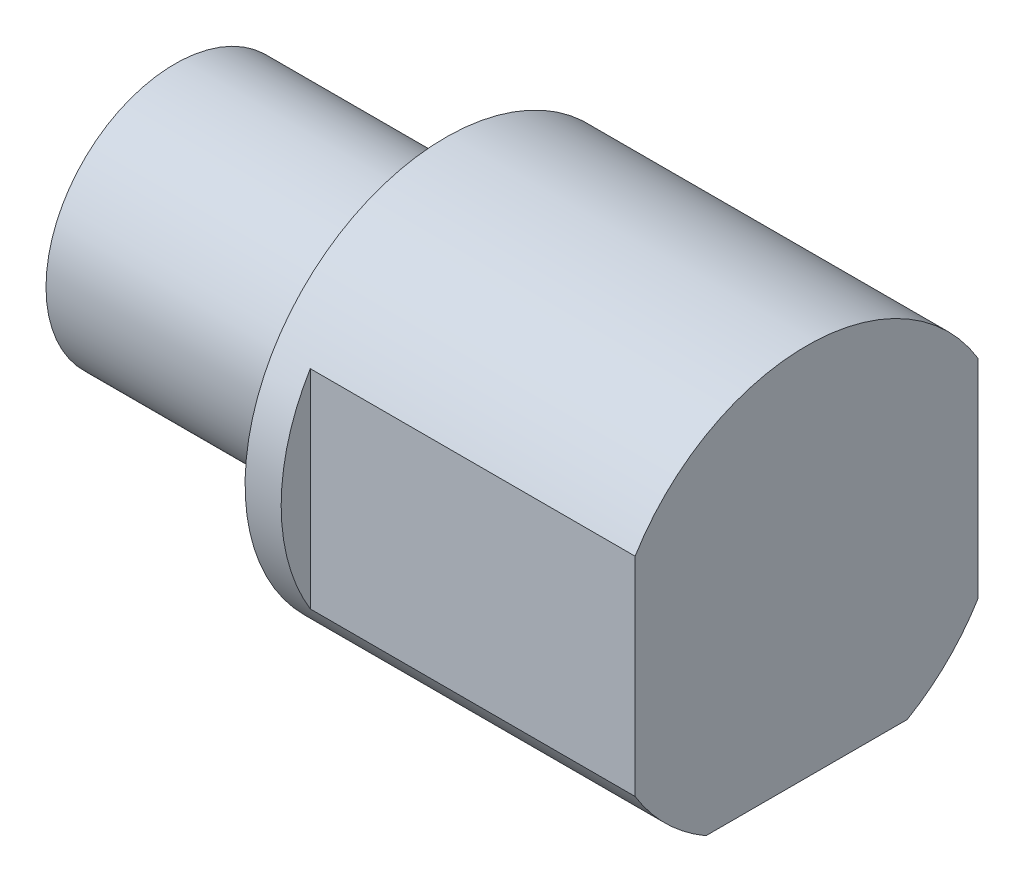
ISO-10303-21;
HEADER;
FILE_DESCRIPTION(('STEP AP214'),'2;1');
FILE_NAME('part.step','',(''),(''),'','','');
FILE_SCHEMA(('AUTOMOTIVE_DESIGN { 1 0 10303 214 1 1 1 1 }'));
ENDSEC;
DATA;
#1=APPLICATION_CONTEXT('core data for automotive mechanical design processes');
#2=APPLICATION_PROTOCOL_DEFINITION('international standard','automotive_design',2000,#1);
#3=PRODUCT_CONTEXT('',#1,'mechanical');
#4=PRODUCT('Part','Part','',(#3));
#5=PRODUCT_RELATED_PRODUCT_CATEGORY('part','',(#4));
#6=PRODUCT_DEFINITION_FORMATION('','',#4);
#7=PRODUCT_DEFINITION_CONTEXT('part definition',#1,'design');
#8=PRODUCT_DEFINITION('design','',#6,#7);
#9=PRODUCT_DEFINITION_SHAPE('','',#8);
#10=(LENGTH_UNIT() NAMED_UNIT(*) SI_UNIT(.MILLI.,.METRE.));
#11=(NAMED_UNIT(*) PLANE_ANGLE_UNIT() SI_UNIT($,.RADIAN.));
#12=(NAMED_UNIT(*) SI_UNIT($,.STERADIAN.) SOLID_ANGLE_UNIT());
#13=UNCERTAINTY_MEASURE_WITH_UNIT(LENGTH_MEASURE(1.E-05),#10,'distance_accuracy_value','');
#14=(GEOMETRIC_REPRESENTATION_CONTEXT(3) GLOBAL_UNCERTAINTY_ASSIGNED_CONTEXT((#13)) GLOBAL_UNIT_ASSIGNED_CONTEXT((#10,
#11,#12)) REPRESENTATION_CONTEXT('',''));
#15=CARTESIAN_POINT('',(0.,0.,0.));
#16=DIRECTION('',(0.,0.,1.));
#17=DIRECTION('',(1.,0.,0.));
#18=AXIS2_PLACEMENT_3D('',#15,#16,#17);
#19=CARTESIAN_POINT('',(15.,0.,0.));
#20=DIRECTION('',(-1.,0.,0.));
#21=DIRECTION('',(0.,0.,1.));
#22=AXIS2_PLACEMENT_3D('',#19,#20,#21);
#23=CYLINDRICAL_SURFACE('',#22,7.14375);
#24=CARTESIAN_POINT('',(15.,0.,0.));
#25=DIRECTION('',(1.,0.,0.));
#26=DIRECTION('',(0.,0.,-1.));
#27=AXIS2_PLACEMENT_3D('',#24,#25,#26);
#28=CIRCLE('',#27,7.14375);
#29=CARTESIAN_POINT('',(15.,0.,-7.14375));
#30=VERTEX_POINT('',#29);
#31=EDGE_CURVE('E199',#30,#30,#28,.T.);
#32=ORIENTED_EDGE('',*,*,#31,.F.);
#33=EDGE_LOOP('',(#32));
#34=FACE_BOUND('',#33,.T.);
#35=CARTESIAN_POINT('',(0.,0.,0.));
#36=DIRECTION('',(1.,0.,0.));
#37=DIRECTION('',(0.,0.,-1.));
#38=AXIS2_PLACEMENT_3D('',#35,#36,#37);
#39=CIRCLE('',#38,7.14375);
#40=CARTESIAN_POINT('',(0.,0.,-7.14375));
#41=VERTEX_POINT('',#40);
#42=EDGE_CURVE('E202',#41,#41,#39,.T.);
#43=ORIENTED_EDGE('',*,*,#42,.T.);
#44=EDGE_LOOP('',(#43));
#45=FACE_BOUND('',#44,.T.);
#46=ADVANCED_FACE('F32',(#34,#45),#23,.T.);
#47=CARTESIAN_POINT('',(0.,0.,0.));
#48=DIRECTION('',(1.,0.,0.));
#49=DIRECTION('',(0.,0.,-1.));
#50=AXIS2_PLACEMENT_3D('',#47,#48,#49);
#51=PLANE('',#50);
#52=CARTESIAN_POINT('',(0.,0.,0.));
#53=DIRECTION('',(-1.,0.,0.));
#54=DIRECTION('',(0.,0.,1.));
#55=AXIS2_PLACEMENT_3D('',#52,#53,#54);
#56=CIRCLE('',#55,5.15874);
#57=CARTESIAN_POINT('',(0.,0.,5.15874));
#58=VERTEX_POINT('',#57);
#59=EDGE_CURVE('E240',#58,#58,#56,.T.);
#60=ORIENTED_EDGE('',*,*,#59,.F.);
#61=EDGE_LOOP('',(#60));
#62=FACE_BOUND('',#61,.T.);
#63=ORIENTED_EDGE('',*,*,#42,.F.);
#64=EDGE_LOOP('',(#63));
#65=FACE_BOUND('',#64,.T.);
#66=ADVANCED_FACE('F190',(#62,#65),#51,.F.);
#67=CARTESIAN_POINT('',(35.,0.,0.));
#68=DIRECTION('',(-1.,0.,0.));
#69=DIRECTION('',(0.,0.,1.));
#70=AXIS2_PLACEMENT_3D('',#67,#68,#69);
#71=CYLINDRICAL_SURFACE('',#70,11.1125);
#72=CARTESIAN_POINT('',(35.,0.,0.));
#73=DIRECTION('',(1.,0.,0.));
#74=DIRECTION('',(0.,0.,-1.));
#75=AXIS2_PLACEMENT_3D('',#72,#73,#74);
#76=CIRCLE('',#75,11.1125);
#77=CARTESIAN_POINT('',(35.,-9.6125,-5.57561655783466));
#78=VERTEX_POINT('',#77);
#79=CARTESIAN_POINT('',(35.,-5.76521085911001,-9.5));
#80=VERTEX_POINT('',#79);
#81=EDGE_CURVE('E116',#78,#80,#76,.T.);
#82=ORIENTED_EDGE('',*,*,#81,.F.);
#83=DIRECTION('',(-1.,0.,0.));
#84=VECTOR('',#83,1.);
#85=CARTESIAN_POINT('',(35.,-9.6125,-5.57561655783466));
#86=LINE('',#85,#84);
#87=CARTESIAN_POINT('',(17.,-9.6125,-5.57561655783466));
#88=VERTEX_POINT('',#87);
#89=EDGE_CURVE('E46',#78,#88,#86,.T.);
#90=ORIENTED_EDGE('',*,*,#89,.T.);
#91=CARTESIAN_POINT('',(17.,0.,0.));
#92=DIRECTION('',(-1.,0.,0.));
#93=DIRECTION('',(0.,0.,1.));
#94=AXIS2_PLACEMENT_3D('',#91,#92,#93);
#95=CIRCLE('',#94,11.1125);
#96=CARTESIAN_POINT('',(17.,-9.6125,5.57561655783466));
#97=VERTEX_POINT('',#96);
#98=EDGE_CURVE('E11',#88,#97,#95,.T.);
#99=ORIENTED_EDGE('',*,*,#98,.T.);
#100=DIRECTION('',(-1.,0.,0.));
#101=VECTOR('',#100,1.);
#102=CARTESIAN_POINT('',(35.,-9.6125,5.57561655783466));
#103=LINE('',#102,#101);
#104=CARTESIAN_POINT('',(35.,-9.6125,5.57561655783466));
#105=VERTEX_POINT('',#104);
#106=EDGE_CURVE('E99',#97,#105,#103,.F.);
#107=ORIENTED_EDGE('',*,*,#106,.T.);
#108=CARTESIAN_POINT('',(35.,-5.76521085911001,9.5));
#109=VERTEX_POINT('',#108);
#110=EDGE_CURVE('E209',#109,#105,#76,.T.);
#111=ORIENTED_EDGE('',*,*,#110,.F.);
#112=DIRECTION('',(-1.,0.,0.));
#113=VECTOR('',#112,1.);
#114=CARTESIAN_POINT('',(35.,-5.76521085911001,9.5));
#115=LINE('',#114,#113);
#116=CARTESIAN_POINT('',(17.,-5.76521085911001,9.5));
#117=VERTEX_POINT('',#116);
#118=EDGE_CURVE('E224',#109,#117,#115,.T.);
#119=ORIENTED_EDGE('',*,*,#118,.T.);
#120=CARTESIAN_POINT('',(17.,0.,0.));
#121=DIRECTION('',(-1.,0.,0.));
#122=DIRECTION('',(0.,0.,1.));
#123=AXIS2_PLACEMENT_3D('',#120,#121,#122);
#124=CIRCLE('',#123,11.1125);
#125=CARTESIAN_POINT('',(17.,5.76521085911001,9.5));
#126=VERTEX_POINT('',#125);
#127=EDGE_CURVE('E160',#117,#126,#124,.T.);
#128=ORIENTED_EDGE('',*,*,#127,.T.);
#129=DIRECTION('',(-1.,0.,0.));
#130=VECTOR('',#129,1.);
#131=CARTESIAN_POINT('',(35.,5.76521085911001,9.5));
#132=LINE('',#131,#130);
#133=CARTESIAN_POINT('',(35.,5.76521085911001,9.5));
#134=VERTEX_POINT('',#133);
#135=EDGE_CURVE('E223',#126,#134,#132,.F.);
#136=ORIENTED_EDGE('',*,*,#135,.T.);
#137=CARTESIAN_POINT('',(35.,5.76521085911001,-9.5));
#138=VERTEX_POINT('',#137);
#139=EDGE_CURVE('E204',#138,#134,#76,.T.);
#140=ORIENTED_EDGE('',*,*,#139,.F.);
#141=DIRECTION('',(-1.,0.,0.));
#142=VECTOR('',#141,1.);
#143=CARTESIAN_POINT('',(35.,5.76521085911001,-9.5));
#144=LINE('',#143,#142);
#145=CARTESIAN_POINT('',(17.,5.76521085911001,-9.5));
#146=VERTEX_POINT('',#145);
#147=EDGE_CURVE('E237',#138,#146,#144,.T.);
#148=ORIENTED_EDGE('',*,*,#147,.T.);
#149=CARTESIAN_POINT('',(17.,0.,0.));
#150=DIRECTION('',(-1.,0.,0.));
#151=DIRECTION('',(0.,0.,1.));
#152=AXIS2_PLACEMENT_3D('',#149,#150,#151);
#153=CIRCLE('',#152,11.1125);
#154=CARTESIAN_POINT('',(17.,-5.76521085911001,-9.5));
#155=VERTEX_POINT('',#154);
#156=EDGE_CURVE('E215',#146,#155,#153,.T.);
#157=ORIENTED_EDGE('',*,*,#156,.T.);
#158=DIRECTION('',(-1.,0.,0.));
#159=VECTOR('',#158,1.);
#160=CARTESIAN_POINT('',(35.,-5.76521085911001,-9.5));
#161=LINE('',#160,#159);
#162=EDGE_CURVE('E235',#155,#80,#161,.F.);
#163=ORIENTED_EDGE('',*,*,#162,.T.);
#164=EDGE_LOOP('',(#82,#90,#99,#107,#111,#119,#128,#136,#140,#148,#157,#163));
#165=FACE_BOUND('',#164,.T.);
#166=CARTESIAN_POINT('',(15.,0.,0.));
#167=DIRECTION('',(1.,0.,0.));
#168=DIRECTION('',(0.,0.,-1.));
#169=AXIS2_PLACEMENT_3D('',#166,#167,#168);
#170=CIRCLE('',#169,11.1125);
#171=CARTESIAN_POINT('',(15.,0.,-11.1125));
#172=VERTEX_POINT('',#171);
#173=EDGE_CURVE('E245',#172,#172,#170,.T.);
#174=ORIENTED_EDGE('',*,*,#173,.T.);
#175=EDGE_LOOP('',(#174));
#176=FACE_BOUND('',#175,.T.);
#177=ADVANCED_FACE('F113',(#165,#176),#71,.T.);
#178=CARTESIAN_POINT('',(35.,0.,0.));
#179=DIRECTION('',(1.,0.,0.));
#180=DIRECTION('',(0.,0.,-1.));
#181=AXIS2_PLACEMENT_3D('',#178,#179,#180);
#182=PLANE('',#181);
#183=DIRECTION('',(0.,0.,-1.));
#184=VECTOR('',#183,1.);
#185=CARTESIAN_POINT('',(35.,-9.6125,11.1125));
#186=LINE('',#185,#184);
#187=EDGE_CURVE('E103',#105,#78,#186,.T.);
#188=ORIENTED_EDGE('',*,*,#187,.T.);
#189=ORIENTED_EDGE('',*,*,#81,.T.);
#190=DIRECTION('',(0.,-1.,0.));
#191=VECTOR('',#190,1.);
#192=CARTESIAN_POINT('',(35.,0.,-9.5));
#193=LINE('',#192,#191);
#194=EDGE_CURVE('E206',#138,#80,#193,.T.);
#195=ORIENTED_EDGE('',*,*,#194,.F.);
#196=ORIENTED_EDGE('',*,*,#139,.T.);
#197=DIRECTION('',(0.,1.,0.));
#198=VECTOR('',#197,1.);
#199=CARTESIAN_POINT('',(35.,0.,9.5));
#200=LINE('',#199,#198);
#201=EDGE_CURVE('E217',#109,#134,#200,.T.);
#202=ORIENTED_EDGE('',*,*,#201,.F.);
#203=ORIENTED_EDGE('',*,*,#110,.T.);
#204=EDGE_LOOP('',(#188,#189,#195,#196,#202,#203));
#205=FACE_BOUND('',#204,.T.);
#206=ADVANCED_FACE('F250',(#205),#182,.T.);
#207=CARTESIAN_POINT('',(15.,0.,0.));
#208=DIRECTION('',(1.,0.,0.));
#209=DIRECTION('',(0.,0.,-1.));
#210=AXIS2_PLACEMENT_3D('',#207,#208,#209);
#211=PLANE('',#210);
#212=ORIENTED_EDGE('',*,*,#31,.T.);
#213=EDGE_LOOP('',(#212));
#214=FACE_BOUND('',#213,.T.);
#215=ORIENTED_EDGE('',*,*,#173,.F.);
#216=EDGE_LOOP('',(#215));
#217=FACE_BOUND('',#216,.T.);
#218=ADVANCED_FACE('F333',(#214,#217),#211,.F.);
#219=CARTESIAN_POINT('',(26.6628162901977,0.,0.));
#220=DIRECTION('',(-1.,0.,0.));
#221=DIRECTION('',(0.,0.,1.));
#222=AXIS2_PLACEMENT_3D('',#219,#220,#221);
#223=CONICAL_SURFACE('',#222,5.15874,1.02974425867665);
#224=CARTESIAN_POINT('',(29.7625,0.,0.));
#225=CARTESIAN_POINT('',(29.7624930028615,4.20430499467001E-06,1.08597593433312E-05));
#226=CARTESIAN_POINT('',(29.7624860057229,8.4085876942521E-06,2.17195272931255E-05));
#227=CARTESIAN_POINT('',(29.762444672713,3.32437019313987E-05,8.5869643104111E-05));
#228=CARTESIAN_POINT('',(29.7624103368409,5.38740187837906E-05,0.000139160189751005));
#229=CARTESIAN_POINT('',(29.7622386574811,0.000157022915305526,0.000405613963916012));
#230=CARTESIAN_POINT('',(29.762101313995,0.000239533431615619,0.000618780313867793));
#231=CARTESIAN_POINT('',(29.7614145965602,0.000652043000831133,0.00168462872218226));
#232=CARTESIAN_POINT('',(29.7608652226125,0.000981913007836379,0.0025373607332351));
#233=CARTESIAN_POINT('',(29.7581183525929,0.0026305740280279,0.00680128774402228));
#234=CARTESIAN_POINT('',(29.7559208566313,0.00394729742416479,0.0102132821314489));
#235=CARTESIAN_POINT('',(29.7449333563568,0.0105198361626609,0.0272775638157698));
#236=CARTESIAN_POINT('',(29.7361433529909,0.0157423793156134,0.0409426835898945));
#237=CARTESIAN_POINT('',(29.6921920071205,0.0416744526543953,0.109339486849523));
#238=CARTESIAN_POINT('',(29.6570310334146,0.061839437540482,0.164278023117815));
#239=CARTESIAN_POINT('',(29.5514465610366,0.120488892831472,0.329945025095136));
#240=CARTESIAN_POINT('',(29.481025805915,0.157062403850388,0.441363979368093));
#241=CARTESIAN_POINT('',(29.3402893635549,0.224155777483775,0.665981503868459));
#242=CARTESIAN_POINT('',(29.2699736388907,0.254679185175096,0.779178989738839));
#243=CARTESIAN_POINT('',(29.1017829483487,0.319380048804845,1.05228380627182));
#244=CARTESIAN_POINT('',(29.0039602925985,0.350262443525442,1.21302993706946));
#245=CARTESIAN_POINT('',(28.8087958409162,0.396210816178389,1.53711480573167));
#246=CARTESIAN_POINT('',(28.711454088001,0.411275403812248,1.70045377021148));
#247=CARTESIAN_POINT('',(28.5167793848732,0.424598257690499,2.0294961429927));
#248=CARTESIAN_POINT('',(28.4194520326518,0.42272897569222,2.1952080932801));
#249=CARTESIAN_POINT('',(28.2257081522414,0.402490217050304,2.52607394990571));
#250=CARTESIAN_POINT('',(28.129291475528,0.384123479673208,2.69122794431843));
#251=CARTESIAN_POINT('',(27.9395179409233,0.333439263840167,3.0159062317535));
#252=CARTESIAN_POINT('',(27.8461417839411,0.30145314363354,3.17547253791926));
#253=CARTESIAN_POINT('',(27.6599807528108,0.225923382627303,3.49223910255772));
#254=CARTESIAN_POINT('',(27.5671961535237,0.182374720638695,3.64943830166654));
#255=CARTESIAN_POINT('',(27.3817153817414,0.0858297352478213,3.96172777747655));
#256=CARTESIAN_POINT('',(27.2890206931297,0.032800413516446,4.11680858359344));
#257=CARTESIAN_POINT('',(27.1038645806189,-0.0806339358714834,4.42433071549515));
#258=CARTESIAN_POINT('',(27.011403127568,-0.141037989858388,4.57677238669122));
#259=CARTESIAN_POINT('',(26.8280694002558,-0.266622200390302,4.87674877485534));
#260=CARTESIAN_POINT('',(26.737196043658,-0.331707261621015,5.02432295708092));
#261=CARTESIAN_POINT('',(26.5554018045496,-0.466362492464465,5.31738826333468));
#262=CARTESIAN_POINT('',(26.4644809189344,-0.535933004897966,5.4628792271025));
#263=CARTESIAN_POINT('',(26.2833352098978,-0.678026635160563,5.75073001163144));
#264=CARTESIAN_POINT('',(26.1931113648143,-0.750518094188772,5.89310615827454));
#265=CARTESIAN_POINT('',(26.0125435429469,-0.898368455418109,6.17621663874536));
#266=CARTESIAN_POINT('',(25.9221996095388,-0.973726503984765,6.31695144528307));
#267=CARTESIAN_POINT('',(25.8317633451439,-1.05021216751675,6.45699481970518));
#268=B_SPLINE_CURVE_WITH_KNOTS('',3,(#224,#225,#226,#227,#228,#229,#230,#231,#232,#233,#234,
#235,#236,#237,#238,#239,#240,#241,#242,#243,#244,#245,#246,#247,#248,#249,#250,#251,#252,#253,
#254,#255,#256,#257,#258,#259,#260,#261,#262,#263,#264,#265,#266,#267),.UNSPECIFIED.,.F.,.F.,(4,
2,2,2,2,2,2,2,2,2,2,2,2,2,2,2,2,2,2,2,2,4),(0.,4.07570179373821E-05,0.000240757017945375,
0.00104075701842514,0.00424075704908811,0.0170407590218322,0.068240887966296,0.273049861180939,
0.683275266655643,1.0932595840344,1.66470584038183,2.23620231951776,2.81200694714631,
3.38771598483056,3.95015355294188,4.51283576774208,5.07751599410287,5.64212174743628,
6.19742446811935,6.75276968073586,7.30318956511519,7.8534468051391),.UNSPECIFIED.);
#269=CARTESIAN_POINT('',(29.7625,0.,0.));
#270=VERTEX_POINT('',#269);
#271=CARTESIAN_POINT('',(27.2358583177678,0.,4.20503791099066));
#272=VERTEX_POINT('',#271);
#273=EDGE_CURVE('E39',#270,#272,#268,.T.);
#274=ORIENTED_EDGE('',*,*,#273,.T.);
#275=CARTESIAN_POINT('',(27.2081996871113,0.516074000000099,4.21962799211513));
#276=CARTESIAN_POINT('',(27.2147462195101,0.45438715155513,4.21620059050692));
#277=CARTESIAN_POINT('',(27.2201736852466,0.39255271257799,4.21334266670164));
#278=CARTESIAN_POINT('',(27.2286948483538,0.268676666289225,4.20884195519441));
#279=CARTESIAN_POINT('',(27.2317884226392,0.206635048224627,4.20719923158005));
#280=CARTESIAN_POINT('',(27.2374150191848,0.0206372787228872,4.20421335427265));
#281=CARTESIAN_POINT('',(27.2363260121284,-0.103486745582434,4.20479544113461));
#282=CARTESIAN_POINT('',(27.224650729984,-0.349317759308329,4.21098210998094));
#283=CARTESIAN_POINT('',(27.2142025790625,-0.471033675675645,4.21651364566125));
#284=CARTESIAN_POINT('',(27.1849401273388,-0.713191362492389,4.2317505812388));
#285=CARTESIAN_POINT('',(27.1661233989748,-0.833632752840136,4.24145719221744));
#286=CARTESIAN_POINT('',(27.1053451627183,-1.15947442502139,4.27208970915762));
#287=CARTESIAN_POINT('',(27.0564890127045,-1.36327644577151,4.29605117232379));
#288=CARTESIAN_POINT('',(26.94475966781,-1.76671218809316,4.34776939236104));
#289=CARTESIAN_POINT('',(26.8818589438489,-1.9663368693707,4.37553356110583));
#290=CARTESIAN_POINT('',(26.7796110372663,-2.26632748747554,4.41767231698734));
#291=CARTESIAN_POINT('',(26.7436381268347,-2.36787237004317,4.43200933163143));
#292=CARTESIAN_POINT('',(26.6696863834803,-2.57027568927651,4.46039421271488));
#293=CARTESIAN_POINT('',(26.631707463181,-2.67113409582478,4.47444206652208));
#294=CARTESIAN_POINT('',(26.5543019865565,-2.87182600165777,4.50191403303865));
#295=CARTESIAN_POINT('',(26.5148830309958,-2.971662088197,4.51534075553594));
#296=CARTESIAN_POINT('',(26.4347048226713,-3.17087592564999,4.541455393787));
#297=CARTESIAN_POINT('',(26.3939457555845,-3.27025373790172,4.55414341122149));
#298=CARTESIAN_POINT('',(26.3526479192175,-3.36946167222788,4.56637162927379));
#299=B_SPLINE_CURVE_WITH_KNOTS('',3,(#275,#276,#277,#278,#279,#280,#281,#282,#283,#284,#285,
#286,#287,#288,#289,#290,#291,#292,#293,#294,#295,#296,#297,#298),.UNSPECIFIED.,.F.,.F.,(4,2,2,
2,2,2,2,2,2,2,2,4),(0.,0.186362455724692,0.372734739191113,0.744590841585828,1.11104781819082,
1.47761116625322,2.1094680311672,2.74257445823186,3.06859187304861,3.39462350004633,
3.71913038428323,4.04359249491526),.UNSPECIFIED.);
#300=CARTESIAN_POINT('',(26.6628162901977,-2.58769205133589,4.46278480716391));
#301=VERTEX_POINT('',#300);
#302=EDGE_CURVE('E130',#272,#301,#299,.T.);
#303=ORIENTED_EDGE('',*,*,#302,.T.);
#304=CARTESIAN_POINT('',(26.6628162901977,0.,0.));
#305=DIRECTION('',(-1.,0.,0.));
#306=DIRECTION('',(0.,0.,1.));
#307=AXIS2_PLACEMENT_3D('',#304,#305,#306);
#308=CIRCLE('',#307,5.15874);
#309=CARTESIAN_POINT('',(26.6628162901977,-2.58769205133589,-4.46278480716391));
#310=VERTEX_POINT('',#309);
#311=EDGE_CURVE('E243',#301,#310,#308,.T.);
#312=ORIENTED_EDGE('',*,*,#311,.T.);
#313=CARTESIAN_POINT('',(26.3526479192175,-3.36946167222788,-4.56637162927379));
#314=CARTESIAN_POINT('',(26.4023722860239,-3.24998032314956,-4.55165409186257));
#315=CARTESIAN_POINT('',(26.451331670443,-3.13025787701526,-4.53625639074325));
#316=CARTESIAN_POINT('',(26.5472338034232,-2.89010006866323,-4.50444214874784));
#317=CARTESIAN_POINT('',(26.5941759238378,-2.76966449748221,-4.48802529435704));
#318=CARTESIAN_POINT('',(26.686100686563,-2.52640119936928,-4.45431281506316));
#319=CARTESIAN_POINT('',(26.7310512080497,-2.40356244730855,-4.43700872711982));
#320=CARTESIAN_POINT('',(26.8176061620485,-2.15673531847772,-4.40225910852575));
#321=CARTESIAN_POINT('',(26.8592108905239,-2.03274704447694,-4.38481359053629));
#322=CARTESIAN_POINT('',(26.9364228912336,-1.78857973114709,-4.35124916527072));
#323=CARTESIAN_POINT('',(26.9722093911762,-1.66846135350444,-4.33510535614245));
#324=CARTESIAN_POINT('',(27.0386784275021,-1.42659297490015,-4.30424669844029));
#325=CARTESIAN_POINT('',(27.0693600911291,-1.30484269877531,-4.28953209439129));
#326=CARTESIAN_POINT('',(27.1240595106145,-1.06022159110557,-4.2627107135526));
#327=CARTESIAN_POINT('',(27.1481115527733,-0.937360053687519,-4.2505905945888));
#328=CARTESIAN_POINT('',(27.1882049950025,-0.690056495352691,-4.23009238616384));
#329=CARTESIAN_POINT('',(27.2042517909812,-0.565615597171812,-4.22171177650273));
#330=CARTESIAN_POINT('',(27.22282959255,-0.361660769216671,-4.21194705238387));
#331=CARTESIAN_POINT('',(27.2281612749298,-0.282465649756153,-4.20912316957932));
#332=CARTESIAN_POINT('',(27.2349060657098,-0.12379915171103,-4.20554586213731));
#333=CARTESIAN_POINT('',(27.2363163990966,-0.0443276173166541,-4.2047939037379));
#334=CARTESIAN_POINT('',(27.2351343173261,0.115507066387072,-4.20542331002818));
#335=CARTESIAN_POINT('',(27.2324947322838,0.195869733931046,-4.206829814636));
#336=CARTESIAN_POINT('',(27.223269281537,0.356268606312871,-4.2117087799542));
#337=CARTESIAN_POINT('',(27.216685284554,0.436304947685788,-4.21518026234637));
#338=CARTESIAN_POINT('',(27.2081996871113,0.516074000000018,-4.21962799211521));
#339=B_SPLINE_CURVE_WITH_KNOTS('',3,(#313,#314,#315,#316,#317,#318,#319,#320,#321,#322,#323,
#324,#325,#326,#327,#328,#329,#330,#331,#332,#333,#334,#335,#336,#337,#338),.UNSPECIFIED.,.F.,
.F.,(4,2,2,2,2,2,2,2,2,2,2,2,4),(0.,0.390753311147557,0.781627428331179,1.17742393069547,
1.57318538295965,1.95220960196476,2.33129855499674,2.70838853587239,3.08522399596442,
3.32338682940146,3.56171816021815,3.80284651078445,4.04386071359388),.UNSPECIFIED.);
#340=CARTESIAN_POINT('',(27.2358583177678,0.,-4.20503791099066));
#341=VERTEX_POINT('',#340);
#342=EDGE_CURVE('E54',#310,#341,#339,.T.);
#343=ORIENTED_EDGE('',*,*,#342,.T.);
#344=CARTESIAN_POINT('',(29.7625,0.,0.));
#345=CARTESIAN_POINT('',(29.7624930028615,4.20430499467001E-06,-1.08597593433312E-05));
#346=CARTESIAN_POINT('',(29.7624860057229,8.4085876942521E-06,-2.17195272931255E-05));
#347=CARTESIAN_POINT('',(29.762444672713,3.32437019313987E-05,-8.5869643104111E-05));
#348=CARTESIAN_POINT('',(29.7624103368409,5.38740187837906E-05,-0.000139160189751005));
#349=CARTESIAN_POINT('',(29.7622386574811,0.000157022915305526,-0.000405613963916012));
#350=CARTESIAN_POINT('',(29.762101313995,0.000239533431615619,-0.000618780313867793));
#351=CARTESIAN_POINT('',(29.7614145965602,0.000652043000831133,-0.00168462872218226));
#352=CARTESIAN_POINT('',(29.7608652226125,0.000981913007836379,-0.0025373607332351));
#353=CARTESIAN_POINT('',(29.7581183525929,0.0026305740280279,-0.00680128774402228));
#354=CARTESIAN_POINT('',(29.7559208566313,0.00394729742416479,-0.0102132821314489));
#355=CARTESIAN_POINT('',(29.7449333563568,0.0105198361626609,-0.0272775638157698));
#356=CARTESIAN_POINT('',(29.7361433529909,0.0157423793156134,-0.0409426835898945));
#357=CARTESIAN_POINT('',(29.6921920071205,0.0416744526543953,-0.109339486849523));
#358=CARTESIAN_POINT('',(29.6570310334146,0.061839437540482,-0.164278023117815));
#359=CARTESIAN_POINT('',(29.5514465610366,0.120488892831472,-0.329945025095136));
#360=CARTESIAN_POINT('',(29.481025805915,0.157062403850388,-0.441363979368093));
#361=CARTESIAN_POINT('',(29.3402893635549,0.224155777483775,-0.665981503868459));
#362=CARTESIAN_POINT('',(29.2699736388907,0.254679185175096,-0.779178989738839));
#363=CARTESIAN_POINT('',(29.1017829483487,0.319380048804845,-1.05228380627182));
#364=CARTESIAN_POINT('',(29.0039602925985,0.350262443525442,-1.21302993706946));
#365=CARTESIAN_POINT('',(28.8087958409162,0.396210816178389,-1.53711480573167));
#366=CARTESIAN_POINT('',(28.711454088001,0.411275403812248,-1.70045377021148));
#367=CARTESIAN_POINT('',(28.5167793848732,0.424598257690499,-2.0294961429927));
#368=CARTESIAN_POINT('',(28.4194520326518,0.42272897569222,-2.1952080932801));
#369=CARTESIAN_POINT('',(28.2257081522414,0.402490217050304,-2.52607394990571));
#370=CARTESIAN_POINT('',(28.129291475528,0.384123479673208,-2.69122794431843));
#371=CARTESIAN_POINT('',(27.9395179409233,0.333439263840167,-3.0159062317535));
#372=CARTESIAN_POINT('',(27.8461417839411,0.30145314363354,-3.17547253791926));
#373=CARTESIAN_POINT('',(27.6599807528108,0.225923382627303,-3.49223910255772));
#374=CARTESIAN_POINT('',(27.5671961535237,0.182374720638695,-3.64943830166654));
#375=CARTESIAN_POINT('',(27.3817153817414,0.0858297352478213,-3.96172777747655));
#376=CARTESIAN_POINT('',(27.2890206931297,0.032800413516446,-4.11680858359344));
#377=CARTESIAN_POINT('',(27.1038645806189,-0.0806339358714834,-4.42433071549515));
#378=CARTESIAN_POINT('',(27.011403127568,-0.141037989858388,-4.57677238669122));
#379=CARTESIAN_POINT('',(26.8280694002558,-0.266622200390302,-4.87674877485534));
#380=CARTESIAN_POINT('',(26.737196043658,-0.331707261621015,-5.02432295708092));
#381=CARTESIAN_POINT('',(26.5554018045496,-0.466362492464465,-5.31738826333468));
#382=CARTESIAN_POINT('',(26.4644809189344,-0.535933004897966,-5.4628792271025));
#383=CARTESIAN_POINT('',(26.2833352098978,-0.678026635160563,-5.75073001163144));
#384=CARTESIAN_POINT('',(26.1931113648143,-0.750518094188772,-5.89310615827454));
#385=CARTESIAN_POINT('',(26.0125435429469,-0.898368455418109,-6.17621663874536));
#386=CARTESIAN_POINT('',(25.9221996095388,-0.973726503984765,-6.31695144528307));
#387=CARTESIAN_POINT('',(25.8317633451439,-1.05021216751675,-6.45699481970518));
#388=B_SPLINE_CURVE_WITH_KNOTS('',3,(#344,#345,#346,#347,#348,#349,#350,#351,#352,#353,#354,
#355,#356,#357,#358,#359,#360,#361,#362,#363,#364,#365,#366,#367,#368,#369,#370,#371,#372,#373,
#374,#375,#376,#377,#378,#379,#380,#381,#382,#383,#384,#385,#386,#387),.UNSPECIFIED.,.F.,.F.,(4,
2,2,2,2,2,2,2,2,2,2,2,2,2,2,2,2,2,2,2,2,4),(0.,4.07570179373821E-05,0.000240757017945375,
0.00104075701842514,0.00424075704908811,0.0170407590218322,0.068240887966296,0.273049861180939,
0.683275266655643,1.0932595840344,1.66470584038183,2.23620231951776,2.81200694714631,
3.38771598483056,3.95015355294188,4.51283576774208,5.07751599410287,5.64212174743628,
6.19742446811935,6.75276968073586,7.30318956511519,7.8534468051391),.UNSPECIFIED.);
#389=EDGE_CURVE('E159',#341,#270,#388,.F.);
#390=ORIENTED_EDGE('',*,*,#389,.T.);
#391=EDGE_LOOP('',(#274,#303,#312,#343,#390));
#392=FACE_BOUND('',#391,.T.);
#393=ADVANCED_FACE('F135',(#392),#223,.F.);
#394=CARTESIAN_POINT('',(0.,0.,0.));
#395=DIRECTION('',(-1.,0.,0.));
#396=DIRECTION('',(0.,0.,1.));
#397=AXIS2_PLACEMENT_3D('',#394,#395,#396);
#398=CYLINDRICAL_SURFACE('',#397,5.15874);
#399=ORIENTED_EDGE('',*,*,#311,.F.);
#400=CARTESIAN_POINT('',(26.6628162901977,-2.58769205133589,4.46278480716391));
#401=CARTESIAN_POINT('',(26.6039102513428,-2.54986516327323,4.48472588342269));
#402=CARTESIAN_POINT('',(26.5442053215483,-2.51265669170508,4.50565029680147));
#403=CARTESIAN_POINT('',(26.422936229291,-2.4399888061248,4.54541019780409));
#404=CARTESIAN_POINT('',(26.3613694674486,-2.40453203847045,4.56424257546309));
#405=CARTESIAN_POINT('',(26.234985263664,-2.33528078175161,4.60006693070922));
#406=CARTESIAN_POINT('',(26.1701268330414,-2.30153625721603,4.61701243925816));
#407=CARTESIAN_POINT('',(26.0382499009406,-2.23737290309752,4.64844476502656));
#408=CARTESIAN_POINT('',(25.9712324378795,-2.20695250475906,4.66293274382709));
#409=CARTESIAN_POINT('',(25.7904746328176,-2.13202685772834,4.69783912214381));
#410=CARTESIAN_POINT('',(25.6746737084345,-2.09121555181965,4.71599290944393));
#411=CARTESIAN_POINT('',(25.4380631785921,-2.02739455689247,4.74378740520531));
#412=CARTESIAN_POINT('',(25.3173033775719,-2.00423929671029,4.7534978233519));
#413=CARTESIAN_POINT('',(25.0713949827632,-1.98021243160095,4.76356786415787));
#414=CARTESIAN_POINT('',(24.9462095098462,-1.97963878170583,4.76380245827996));
#415=CARTESIAN_POINT('',(24.6980721107205,-2.00173074425558,4.75455296629423));
#416=CARTESIAN_POINT('',(24.5751282840518,-2.02446819157237,4.74503883882963));
#417=CARTESIAN_POINT('',(24.3016641712092,-2.09684660997704,4.7135664216713));
#418=CARTESIAN_POINT('',(24.1530734406618,-2.15224212412939,4.68886757872246));
#419=CARTESIAN_POINT('',(23.8660173669799,-2.28045104619381,4.62787138010096));
#420=CARTESIAN_POINT('',(23.7275959371107,-2.35333478875388,4.59152698481348));
#421=CARTESIAN_POINT('',(23.4559533603807,-2.51052770190929,4.50755220585036));
#422=CARTESIAN_POINT('',(23.3229659175416,-2.5950876718276,4.45964924584336));
#423=CARTESIAN_POINT('',(23.0644286247943,-2.76920974687621,4.35367627907584));
#424=CARTESIAN_POINT('',(22.9388857362589,-2.85877638632744,4.2955969510084));
#425=CARTESIAN_POINT('',(22.6941902080334,-3.03993485629652,4.16936609031681));
#426=CARTESIAN_POINT('',(22.5750471774949,-3.13152945574776,4.10119995881076));
#427=CARTESIAN_POINT('',(22.3429985738052,-3.31447919494501,3.95481431751801));
#428=CARTESIAN_POINT('',(22.2300908693203,-3.40583440621897,3.87659827374521));
#429=CARTESIAN_POINT('',(22.0009378909213,-3.59457765294629,3.70263253590851));
#430=CARTESIAN_POINT('',(21.8852594541204,-3.6917974991143,3.60594880684831));
#431=CARTESIAN_POINT('',(21.6617961983285,-3.88218819630007,3.40012957192761));
#432=CARTESIAN_POINT('',(21.5540137092521,-3.97535784892669,3.29099041485961));
#433=CARTESIAN_POINT('',(21.3476975887912,-4.15547673252812,3.06038131698323));
#434=CARTESIAN_POINT('',(21.2491353356004,-4.24244499965694,2.93895214893911));
#435=CARTESIAN_POINT('',(21.0623092148737,-4.40848867527603,2.68347971719502));
#436=CARTESIAN_POINT('',(20.9740431701292,-4.48756575190318,2.54943913114098));
#437=CARTESIAN_POINT('',(20.786645595702,-4.65633477811752,2.22982432891737));
#438=CARTESIAN_POINT('',(20.6912883992326,-4.74288949949109,2.04026698019139));
#439=CARTESIAN_POINT('',(20.5663766973768,-4.85673973722254,1.74241884942646));
#440=CARTESIAN_POINT('',(20.5277531515299,-4.8920326352793,1.64085848538328));
#441=CARTESIAN_POINT('',(20.4570966589757,-4.95670847672109,1.4336645799626));
#442=CARTESIAN_POINT('',(20.4250605203035,-4.98609428226543,1.32803304090012));
#443=CARTESIAN_POINT('',(20.3678690846939,-5.0386208660715,1.11235232345399));
#444=CARTESIAN_POINT('',(20.3427765310838,-5.06170467492537,1.00227254943331));
#445=CARTESIAN_POINT('',(20.3003470938644,-5.10077061648954,0.77943716582716));
#446=CARTESIAN_POINT('',(20.2830063010173,-5.11675632876543,0.666682935259783));
#447=CARTESIAN_POINT('',(20.2564389749092,-5.14125830579034,0.439449666145739));
#448=CARTESIAN_POINT('',(20.2472099364129,-5.14977687669012,0.324971171238682));
#449=CARTESIAN_POINT('',(20.2370680924525,-5.15913835151746,0.0953386775830786));
#450=CARTESIAN_POINT('',(20.2361543479608,-5.15998212214314,-0.0198152434214294));
#451=CARTESIAN_POINT('',(20.2422654815439,-5.15434080072654,-0.235777220258699));
#452=CARTESIAN_POINT('',(20.2483443466925,-5.14872905596729,-0.336637225869671));
#453=CARTESIAN_POINT('',(20.266833887553,-5.13167037588941,-0.537308466206259));
#454=CARTESIAN_POINT('',(20.2792465417842,-5.12022161723264,-0.637119363267176));
#455=CARTESIAN_POINT('',(20.3101913340827,-5.09170513745816,-0.834935497413211));
#456=CARTESIAN_POINT('',(20.3287213573122,-5.07463935820868,-0.932941346177069));
#457=CARTESIAN_POINT('',(20.3716049799933,-5.03519242989703,-1.12659616990782));
#458=CARTESIAN_POINT('',(20.3959609101316,-5.0128091535649,-1.22224418467457));
#459=CARTESIAN_POINT('',(20.4775480801518,-4.93794363304358,-1.50585329783416));
#460=CARTESIAN_POINT('',(20.5431425492109,-4.87789030510401,-1.6895088208801));
#461=CARTESIAN_POINT('',(20.6932717356471,-4.74111188504429,-2.04213833685758));
#462=CARTESIAN_POINT('',(20.7778152618051,-4.66437903967828,-2.21110545077709));
#463=CARTESIAN_POINT('',(20.9390111485299,-4.51906401823326,-2.49175643200249));
#464=CARTESIAN_POINT('',(21.0121484564128,-4.45341923730544,-2.60703588255958));
#465=CARTESIAN_POINT('',(21.1660852980411,-4.3161187066014,-2.82855036001102));
#466=CARTESIAN_POINT('',(21.2468857275868,-4.24446225418862,-2.93478432674874));
#467=CARTESIAN_POINT('',(21.415400500786,-4.0962098966456,-3.13840114044063));
#468=CARTESIAN_POINT('',(21.5031301589346,-4.01960312263734,-3.2357632962319));
#469=CARTESIAN_POINT('',(21.6846122344619,-3.86275834145244,-3.42147121227367));
#470=CARTESIAN_POINT('',(21.7783638742225,-3.78252080351003,-3.5098181328624));
#471=CARTESIAN_POINT('',(21.9736741983005,-3.61760048243029,-3.67966070946176));
#472=CARTESIAN_POINT('',(22.0753648858631,-3.53285748588099,-3.76094555819375));
#473=CARTESIAN_POINT('',(22.2842561957769,-3.36196977048482,-3.91445349732391));
#474=CARTESIAN_POINT('',(22.3914571002554,-3.27582498001964,-3.98667612307634));
#475=CARTESIAN_POINT('',(22.6111830009656,-3.10370278754954,-4.12208574729192));
#476=CARTESIAN_POINT('',(22.7236985869814,-3.01772535103999,-4.18528797398989));
#477=CARTESIAN_POINT('',(22.9545451306192,-2.84762595380686,-4.30282416200746));
#478=CARTESIAN_POINT('',(23.0728735193344,-2.76350319682241,-4.35716199578316));
#479=CARTESIAN_POINT('',(23.3177266471587,-2.59863570776426,-4.45747701831537));
#480=CARTESIAN_POINT('',(23.4443347502207,-2.51794571839161,-4.50334232139482));
#481=CARTESIAN_POINT('',(23.7059589611515,-2.36524938785399,-4.58537590929213));
#482=CARTESIAN_POINT('',(23.8409784580429,-2.29324658159226,-4.62154025396457));
#483=CARTESIAN_POINT('',(24.0978663386057,-2.17583546345201,-4.67780543362961));
#484=CARTESIAN_POINT('',(24.2182207254545,-2.12799861785059,-4.69957322503747));
#485=CARTESIAN_POINT('',(24.4656855209273,-2.05014331536475,-4.73406462963398));
#486=CARTESIAN_POINT('',(24.5927686365084,-2.02005810740112,-4.74682216003283));
#487=CARTESIAN_POINT('',(24.8286016575553,-1.98731923413741,-4.7606130550833));
#488=CARTESIAN_POINT('',(24.9366958431307,-1.98080456578699,-4.7632996512254));
#489=CARTESIAN_POINT('',(25.1524042259002,-1.9856431357157,-4.76128360370553));
#490=CARTESIAN_POINT('',(25.2600183475381,-1.99699909357433,-4.75657983536666));
#491=CARTESIAN_POINT('',(25.5023701526017,-2.04095501502721,-4.7379103016113));
#492=CARTESIAN_POINT('',(25.6359484861408,-2.07875022428417,-4.72165881536103));
#493=CARTESIAN_POINT('',(25.8955390076568,-2.17215792184491,-4.67941415118449));
#494=CARTESIAN_POINT('',(26.0215007477105,-2.22787641170954,-4.65336285606505));
#495=CARTESIAN_POINT('',(26.2345691780574,-2.3343460819906,-4.6006532197153));
#496=CARTESIAN_POINT('',(26.3233763894502,-2.38272528922609,-4.57585286620158));
#497=CARTESIAN_POINT('',(26.4962147000802,-2.48295644659145,-4.52225319110481));
#498=CARTESIAN_POINT('',(26.580291300438,-2.53475801863922,-4.4935071488328));
#499=CARTESIAN_POINT('',(26.6628162901977,-2.5876920513359,-4.46278480716391));
#500=B_SPLINE_CURVE_WITH_KNOTS('',3,(#400,#401,#402,#403,#404,#405,#406,#407,#408,#409,#410,
#411,#412,#413,#414,#415,#416,#417,#418,#419,#420,#421,#422,#423,#424,#425,#426,#427,#428,#429,
#430,#431,#432,#433,#434,#435,#436,#437,#438,#439,#440,#441,#442,#443,#444,#445,#446,#447,#448,
#449,#450,#451,#452,#453,#454,#455,#456,#457,#458,#459,#460,#461,#462,#463,#464,#465,#466,#467,
#468,#469,#470,#471,#472,#473,#474,#475,#476,#477,#478,#479,#480,#481,#482,#483,#484,#485,#486,
#487,#488,#489,#490,#491,#492,#493,#494,#495,#496,#497,#498,#499),.UNSPECIFIED.,.F.,.F.,(4,2,2,
2,2,2,2,2,2,2,2,2,2,2,2,2,2,2,2,2,2,2,2,2,2,2,2,2,2,2,2,2,2,2,2,2,2,2,2,2,2,2,2,2,2,2,2,2,2,4),
(0.,0.220103096033066,0.440529132393139,0.665543480760493,0.890451175216331,1.26151774850575,
1.62949083303851,2.00231756544812,2.37629665445848,2.85510005223866,3.33586238034014,
3.82931461811839,4.32322123190162,4.81784981047326,5.31230825712394,5.84986355097712,
6.38757683153099,6.92356131406029,7.45943225251014,8.14390145549875,8.48629815963375,
8.82852856052013,9.17375730334759,9.51881174925902,9.86375959102611,10.2086684781172,
10.5118962267548,10.8152187542972,11.1184365297231,11.4217758125971,12.0314013119878,
12.6413107957713,13.0951774572911,13.5490972402727,14.0040499357591,14.4589440008706,
14.9245699225544,15.3902197084451,15.8550738425902,16.3197243558117,16.7901297716995,
17.2607259593518,17.6535536609077,18.0448946491504,18.3681705789767,18.6914957101911,
19.1083540843953,19.5277246172143,19.8398781380213,20.1481691555958),.UNSPECIFIED.);
#501=EDGE_CURVE('E153',#301,#310,#500,.T.);
#502=ORIENTED_EDGE('',*,*,#501,.T.);
#503=EDGE_LOOP('',(#399,#502));
#504=FACE_BOUND('',#503,.T.);
#505=ORIENTED_EDGE('',*,*,#59,.T.);
#506=EDGE_LOOP('',(#505));
#507=FACE_BOUND('',#506,.T.);
#508=ADVANCED_FACE('F166',(#504,#507),#398,.F.);
#509=CARTESIAN_POINT('',(17.,-11.1125,-11.1125));
#510=DIRECTION('',(-1.,0.,0.));
#511=DIRECTION('',(0.,0.,1.));
#512=AXIS2_PLACEMENT_3D('',#509,#510,#511);
#513=PLANE('',#512);
#514=DIRECTION('',(0.,1.,0.));
#515=VECTOR('',#514,1.);
#516=CARTESIAN_POINT('',(17.,-11.1125,-9.5));
#517=LINE('',#516,#515);
#518=EDGE_CURVE('E232',#155,#146,#517,.T.);
#519=ORIENTED_EDGE('',*,*,#518,.F.);
#520=ORIENTED_EDGE('',*,*,#156,.F.);
#521=EDGE_LOOP('',(#519,#520));
#522=FACE_BOUND('',#521,.T.);
#523=ADVANCED_FACE('F170',(#522),#513,.F.);
#524=CARTESIAN_POINT('',(17.,-11.1125,-9.5));
#525=DIRECTION('',(0.,0.,1.));
#526=DIRECTION('',(1.,0.,0.));
#527=AXIS2_PLACEMENT_3D('',#524,#525,#526);
#528=PLANE('',#527);
#529=ORIENTED_EDGE('',*,*,#194,.T.);
#530=ORIENTED_EDGE('',*,*,#162,.F.);
#531=ORIENTED_EDGE('',*,*,#518,.T.);
#532=ORIENTED_EDGE('',*,*,#147,.F.);
#533=EDGE_LOOP('',(#529,#530,#531,#532));
#534=FACE_BOUND('',#533,.T.);
#535=ADVANCED_FACE('F174',(#534),#528,.F.);
#536=CARTESIAN_POINT('',(17.,-11.1125,11.1125));
#537=DIRECTION('',(-1.,0.,0.));
#538=DIRECTION('',(0.,0.,1.));
#539=AXIS2_PLACEMENT_3D('',#536,#537,#538);
#540=PLANE('',#539);
#541=ORIENTED_EDGE('',*,*,#127,.F.);
#542=DIRECTION('',(0.,1.,0.));
#543=VECTOR('',#542,1.);
#544=CARTESIAN_POINT('',(17.,-11.1125,9.5));
#545=LINE('',#544,#543);
#546=EDGE_CURVE('E227',#117,#126,#545,.T.);
#547=ORIENTED_EDGE('',*,*,#546,.T.);
#548=EDGE_LOOP('',(#541,#547));
#549=FACE_BOUND('',#548,.T.);
#550=ADVANCED_FACE('F178',(#549),#540,.F.);
#551=CARTESIAN_POINT('',(17.,-11.1125,9.5));
#552=DIRECTION('',(0.,0.,-1.));
#553=DIRECTION('',(-1.,0.,0.));
#554=AXIS2_PLACEMENT_3D('',#551,#552,#553);
#555=PLANE('',#554);
#556=ORIENTED_EDGE('',*,*,#201,.T.);
#557=ORIENTED_EDGE('',*,*,#135,.F.);
#558=ORIENTED_EDGE('',*,*,#546,.F.);
#559=ORIENTED_EDGE('',*,*,#118,.F.);
#560=EDGE_LOOP('',(#556,#557,#558,#559));
#561=FACE_BOUND('',#560,.T.);
#562=ADVANCED_FACE('F181',(#561),#555,.F.);
#563=CARTESIAN_POINT('',(25.,0.,0.));
#564=DIRECTION('',(0.,-1.,0.));
#565=DIRECTION('',(0.,0.,-1.));
#566=AXIS2_PLACEMENT_3D('',#563,#564,#565);
#567=CONICAL_SURFACE('',#566,4.7625,1.02974425867665);
#568=CARTESIAN_POINT('',(25.,0.,0.));
#569=DIRECTION('',(0.,-1.,0.));
#570=DIRECTION('',(0.,0.,-1.));
#571=AXIS2_PLACEMENT_3D('',#568,#569,#570);
#572=CIRCLE('',#571,4.7625);
#573=EDGE_CURVE('E117',#270,#272,#572,.T.);
#574=ORIENTED_EDGE('',*,*,#573,.T.);
#575=ORIENTED_EDGE('',*,*,#273,.F.);
#576=EDGE_LOOP('',(#574,#575));
#577=FACE_BOUND('',#576,.T.);
#578=ADVANCED_FACE('F147',(#577),#567,.F.);
#579=EDGE_CURVE('E120',#341,#270,#572,.T.);
#580=ORIENTED_EDGE('',*,*,#579,.T.);
#581=ORIENTED_EDGE('',*,*,#389,.F.);
#582=EDGE_LOOP('',(#580,#581));
#583=FACE_BOUND('',#582,.T.);
#584=ADVANCED_FACE('F144',(#583),#567,.F.);
#585=CARTESIAN_POINT('',(25.,-11.1125,0.));
#586=DIRECTION('',(0.,-1.,0.));
#587=DIRECTION('',(0.,0.,-1.));
#588=AXIS2_PLACEMENT_3D('',#585,#586,#587);
#589=CYLINDRICAL_SURFACE('',#588,4.7625);
#590=CARTESIAN_POINT('',(25.,-9.6125,0.));
#591=DIRECTION('',(0.,1.,0.));
#592=DIRECTION('',(0.,0.,1.));
#593=AXIS2_PLACEMENT_3D('',#590,#591,#592);
#594=CIRCLE('',#593,4.7625);
#595=CARTESIAN_POINT('',(25.,-9.6125,4.7625));
#596=VERTEX_POINT('',#595);
#597=EDGE_CURVE('E107',#596,#596,#594,.F.);
#598=ORIENTED_EDGE('',*,*,#597,.T.);
#599=EDGE_LOOP('',(#598));
#600=FACE_BOUND('',#599,.T.);
#601=ORIENTED_EDGE('',*,*,#573,.F.);
#602=ORIENTED_EDGE('',*,*,#579,.F.);
#603=ORIENTED_EDGE('',*,*,#342,.F.);
#604=ORIENTED_EDGE('',*,*,#501,.F.);
#605=ORIENTED_EDGE('',*,*,#302,.F.);
#606=EDGE_LOOP('',(#601,#602,#603,#604,#605));
#607=FACE_BOUND('',#606,.T.);
#608=ADVANCED_FACE('F139',(#600,#607),#589,.F.);
#609=CARTESIAN_POINT('',(17.,-11.1125,11.1125));
#610=DIRECTION('',(-1.,0.,0.));
#611=DIRECTION('',(0.,0.,1.));
#612=AXIS2_PLACEMENT_3D('',#609,#610,#611);
#613=PLANE('',#612);
#614=DIRECTION('',(0.,0.,-1.));
#615=VECTOR('',#614,1.);
#616=CARTESIAN_POINT('',(17.,-9.6125,11.1125));
#617=LINE('',#616,#615);
#618=EDGE_CURVE('E102',#97,#88,#617,.T.);
#619=ORIENTED_EDGE('',*,*,#618,.F.);
#620=ORIENTED_EDGE('',*,*,#98,.F.);
#621=EDGE_LOOP('',(#619,#620));
#622=FACE_BOUND('',#621,.T.);
#623=ADVANCED_FACE('F110',(#622),#613,.F.);
#624=CARTESIAN_POINT('',(35.,-9.6125,11.1125));
#625=DIRECTION('',(0.,1.,0.));
#626=DIRECTION('',(0.,0.,1.));
#627=AXIS2_PLACEMENT_3D('',#624,#625,#626);
#628=PLANE('',#627);
#629=ORIENTED_EDGE('',*,*,#597,.F.);
#630=EDGE_LOOP('',(#629));
#631=FACE_BOUND('',#630,.T.);
#632=ORIENTED_EDGE('',*,*,#187,.F.);
#633=ORIENTED_EDGE('',*,*,#106,.F.);
#634=ORIENTED_EDGE('',*,*,#618,.T.);
#635=ORIENTED_EDGE('',*,*,#89,.F.);
#636=EDGE_LOOP('',(#632,#633,#634,#635));
#637=FACE_BOUND('',#636,.T.);
#638=ADVANCED_FACE('F101',(#631,#637),#628,.F.);
#639=CLOSED_SHELL('',(#46,#66,#177,#206,#218,#393,#508,#523,#535,#550,#562,#578,#584,#608,#623,#638));
#640=MANIFOLD_SOLID_BREP('B2',#639);
#641=ADVANCED_BREP_SHAPE_REPRESENTATION('',(#18,#640),#14);
#642=SHAPE_DEFINITION_REPRESENTATION(#9,#641);
ENDSEC;
END-ISO-10303-21;
